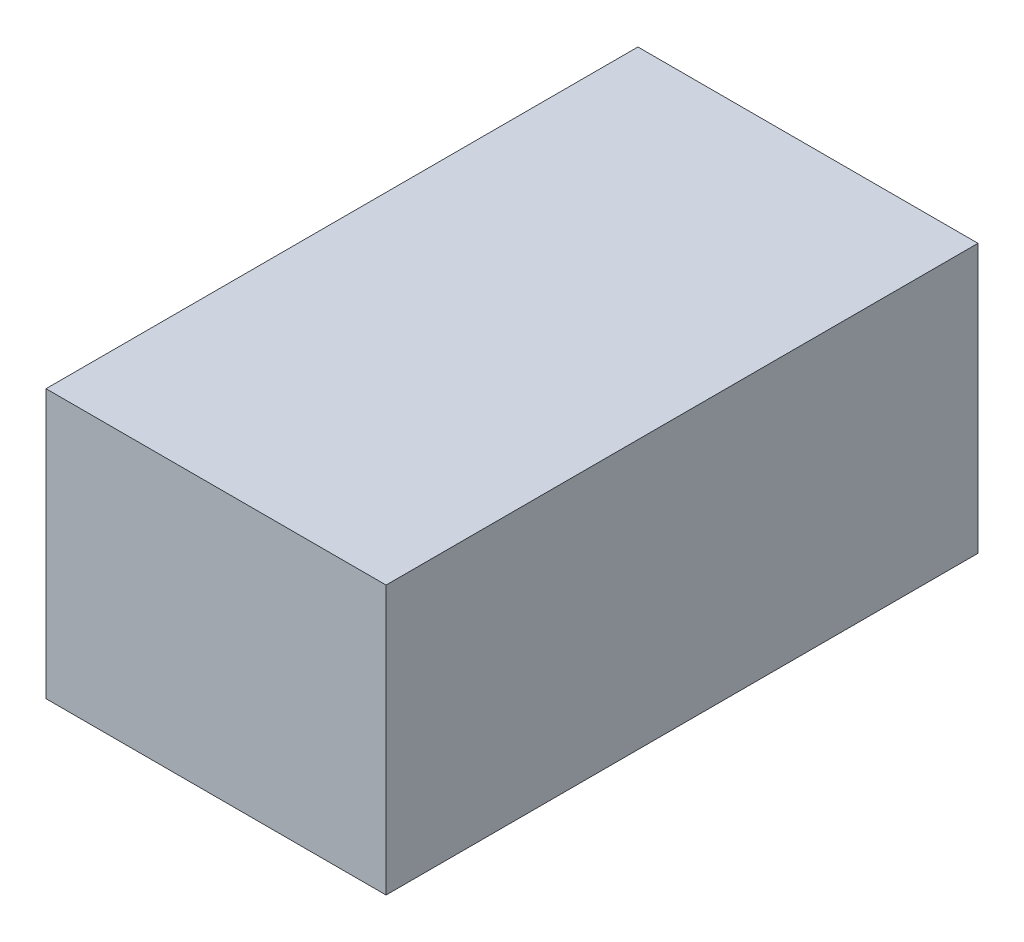
ISO-10303-21;
HEADER;
FILE_DESCRIPTION(('STEP AP214'),'2;1');
FILE_NAME('part.step','',(''),(''),'','','');
FILE_SCHEMA(('AUTOMOTIVE_DESIGN { 1 0 10303 214 1 1 1 1 }'));
ENDSEC;
DATA;
#1=APPLICATION_CONTEXT('core data for automotive mechanical design processes');
#2=APPLICATION_PROTOCOL_DEFINITION('international standard','automotive_design',2000,#1);
#3=PRODUCT_CONTEXT('',#1,'mechanical');
#4=PRODUCT('Part','Part','',(#3));
#5=PRODUCT_RELATED_PRODUCT_CATEGORY('part','',(#4));
#6=PRODUCT_DEFINITION_FORMATION('','',#4);
#7=PRODUCT_DEFINITION_CONTEXT('part definition',#1,'design');
#8=PRODUCT_DEFINITION('design','',#6,#7);
#9=PRODUCT_DEFINITION_SHAPE('','',#8);
#10=(LENGTH_UNIT() NAMED_UNIT(*) SI_UNIT(.MILLI.,.METRE.));
#11=(NAMED_UNIT(*) PLANE_ANGLE_UNIT() SI_UNIT($,.RADIAN.));
#12=(NAMED_UNIT(*) SI_UNIT($,.STERADIAN.) SOLID_ANGLE_UNIT());
#13=UNCERTAINTY_MEASURE_WITH_UNIT(LENGTH_MEASURE(1.E-05),#10,'distance_accuracy_value','');
#14=(GEOMETRIC_REPRESENTATION_CONTEXT(3) GLOBAL_UNCERTAINTY_ASSIGNED_CONTEXT((#13)) GLOBAL_UNIT_ASSIGNED_CONTEXT((#10,
#11,#12)) REPRESENTATION_CONTEXT('',''));
#15=CARTESIAN_POINT('',(0.,0.,0.));
#16=DIRECTION('',(0.,0.,1.));
#17=DIRECTION('',(1.,0.,0.));
#18=AXIS2_PLACEMENT_3D('',#15,#16,#17);
#19=CARTESIAN_POINT('',(0.2413,-0.1905,0.84000086));
#20=DIRECTION('',(0.,0.,1.));
#21=DIRECTION('',(1.,0.,0.));
#22=AXIS2_PLACEMENT_3D('',#19,#20,#21);
#23=PLANE('',#22);
#24=DIRECTION('',(0.,-1.,0.));
#25=VECTOR('',#24,1.);
#26=CARTESIAN_POINT('',(0.2413,0.1905,0.84000086));
#27=LINE('',#26,#25);
#28=CARTESIAN_POINT('',(0.2413,0.1905,0.84000086));
#29=VERTEX_POINT('',#28);
#30=CARTESIAN_POINT('',(0.2413,-0.1905,0.84000086));
#31=VERTEX_POINT('',#30);
#32=EDGE_CURVE('E20',#29,#31,#27,.T.);
#33=ORIENTED_EDGE('',*,*,#32,.F.);
#34=DIRECTION('',(1.,0.,0.));
#35=VECTOR('',#34,1.);
#36=CARTESIAN_POINT('',(-0.2413,0.1905,0.84000086));
#37=LINE('',#36,#35);
#38=CARTESIAN_POINT('',(-0.2413,0.1905,0.84000086));
#39=VERTEX_POINT('',#38);
#40=EDGE_CURVE('E99',#39,#29,#37,.T.);
#41=ORIENTED_EDGE('',*,*,#40,.F.);
#42=DIRECTION('',(0.,1.,0.));
#43=VECTOR('',#42,1.);
#44=CARTESIAN_POINT('',(-0.2413,-0.1905,0.84000086));
#45=LINE('',#44,#43);
#46=CARTESIAN_POINT('',(-0.2413,-0.1905,0.84000086));
#47=VERTEX_POINT('',#46);
#48=EDGE_CURVE('E84',#47,#39,#45,.T.);
#49=ORIENTED_EDGE('',*,*,#48,.F.);
#50=DIRECTION('',(-1.,0.,0.));
#51=VECTOR('',#50,1.);
#52=CARTESIAN_POINT('',(0.2413,-0.1905,0.84000086));
#53=LINE('',#52,#51);
#54=EDGE_CURVE('E88',#31,#47,#53,.T.);
#55=ORIENTED_EDGE('',*,*,#54,.F.);
#56=EDGE_LOOP('',(#33,#41,#49,#55));
#57=FACE_BOUND('',#56,.T.);
#58=ADVANCED_FACE('F17',(#57),#23,.T.);
#59=CARTESIAN_POINT('',(0.2413,-0.1905,0.));
#60=DIRECTION('',(0.,0.,1.));
#61=DIRECTION('',(1.,0.,0.));
#62=AXIS2_PLACEMENT_3D('',#59,#60,#61);
#63=PLANE('',#62);
#64=DIRECTION('',(-1.,0.,0.));
#65=VECTOR('',#64,1.);
#66=CARTESIAN_POINT('',(0.2413,-0.1905,0.));
#67=LINE('',#66,#65);
#68=CARTESIAN_POINT('',(0.2413,-0.1905,0.));
#69=VERTEX_POINT('',#68);
#70=CARTESIAN_POINT('',(-0.2413,-0.1905,0.));
#71=VERTEX_POINT('',#70);
#72=EDGE_CURVE('E72',#69,#71,#67,.T.);
#73=ORIENTED_EDGE('',*,*,#72,.T.);
#74=DIRECTION('',(0.,1.,0.));
#75=VECTOR('',#74,1.);
#76=CARTESIAN_POINT('',(-0.2413,-0.1905,0.));
#77=LINE('',#76,#75);
#78=CARTESIAN_POINT('',(-0.2413,0.1905,0.));
#79=VERTEX_POINT('',#78);
#80=EDGE_CURVE('E102',#71,#79,#77,.T.);
#81=ORIENTED_EDGE('',*,*,#80,.T.);
#82=DIRECTION('',(1.,0.,0.));
#83=VECTOR('',#82,1.);
#84=CARTESIAN_POINT('',(-0.2413,0.1905,0.));
#85=LINE('',#84,#83);
#86=CARTESIAN_POINT('',(0.2413,0.1905,0.));
#87=VERTEX_POINT('',#86);
#88=EDGE_CURVE('E74',#79,#87,#85,.T.);
#89=ORIENTED_EDGE('',*,*,#88,.T.);
#90=DIRECTION('',(0.,-1.,0.));
#91=VECTOR('',#90,1.);
#92=CARTESIAN_POINT('',(0.2413,0.1905,0.));
#93=LINE('',#92,#91);
#94=EDGE_CURVE('E11',#87,#69,#93,.T.);
#95=ORIENTED_EDGE('',*,*,#94,.T.);
#96=EDGE_LOOP('',(#73,#81,#89,#95));
#97=FACE_BOUND('',#96,.T.);
#98=ADVANCED_FACE('F70',(#97),#63,.F.);
#99=CARTESIAN_POINT('',(0.2413,0.1905,0.));
#100=DIRECTION('',(1.,0.,0.));
#101=DIRECTION('',(0.,1.,0.));
#102=AXIS2_PLACEMENT_3D('',#99,#100,#101);
#103=PLANE('',#102);
#104=DIRECTION('',(0.,0.,1.));
#105=VECTOR('',#104,1.);
#106=CARTESIAN_POINT('',(0.2413,0.1905,0.));
#107=LINE('',#106,#105);
#108=EDGE_CURVE('E96',#87,#29,#107,.T.);
#109=ORIENTED_EDGE('',*,*,#108,.T.);
#110=ORIENTED_EDGE('',*,*,#32,.T.);
#111=DIRECTION('',(0.,0.,1.));
#112=VECTOR('',#111,1.);
#113=CARTESIAN_POINT('',(0.2413,-0.1905,0.));
#114=LINE('',#113,#112);
#115=EDGE_CURVE('E80',#69,#31,#114,.T.);
#116=ORIENTED_EDGE('',*,*,#115,.F.);
#117=ORIENTED_EDGE('',*,*,#94,.F.);
#118=EDGE_LOOP('',(#109,#110,#116,#117));
#119=FACE_BOUND('',#118,.T.);
#120=ADVANCED_FACE('F86',(#119),#103,.T.);
#121=CARTESIAN_POINT('',(-0.2413,0.1905,0.));
#122=DIRECTION('',(0.,1.,0.));
#123=DIRECTION('',(1.,0.,0.));
#124=AXIS2_PLACEMENT_3D('',#121,#122,#123);
#125=PLANE('',#124);
#126=DIRECTION('',(0.,0.,1.));
#127=VECTOR('',#126,1.);
#128=CARTESIAN_POINT('',(-0.2413,0.1905,0.));
#129=LINE('',#128,#127);
#130=EDGE_CURVE('E106',#79,#39,#129,.T.);
#131=ORIENTED_EDGE('',*,*,#130,.T.);
#132=ORIENTED_EDGE('',*,*,#40,.T.);
#133=ORIENTED_EDGE('',*,*,#108,.F.);
#134=ORIENTED_EDGE('',*,*,#88,.F.);
#135=EDGE_LOOP('',(#131,#132,#133,#134));
#136=FACE_BOUND('',#135,.T.);
#137=ADVANCED_FACE('F130',(#136),#125,.T.);
#138=CARTESIAN_POINT('',(-0.2413,-0.1905,0.));
#139=DIRECTION('',(-1.,0.,0.));
#140=DIRECTION('',(0.,0.,1.));
#141=AXIS2_PLACEMENT_3D('',#138,#139,#140);
#142=PLANE('',#141);
#143=DIRECTION('',(0.,0.,1.));
#144=VECTOR('',#143,1.);
#145=CARTESIAN_POINT('',(-0.2413,-0.1905,0.));
#146=LINE('',#145,#144);
#147=EDGE_CURVE('E82',#71,#47,#146,.T.);
#148=ORIENTED_EDGE('',*,*,#147,.T.);
#149=ORIENTED_EDGE('',*,*,#48,.T.);
#150=ORIENTED_EDGE('',*,*,#130,.F.);
#151=ORIENTED_EDGE('',*,*,#80,.F.);
#152=EDGE_LOOP('',(#148,#149,#150,#151));
#153=FACE_BOUND('',#152,.T.);
#154=ADVANCED_FACE('F122',(#153),#142,.T.);
#155=CARTESIAN_POINT('',(0.2413,-0.1905,0.));
#156=DIRECTION('',(0.,-1.,0.));
#157=DIRECTION('',(0.,0.,-1.));
#158=AXIS2_PLACEMENT_3D('',#155,#156,#157);
#159=PLANE('',#158);
#160=ORIENTED_EDGE('',*,*,#115,.T.);
#161=ORIENTED_EDGE('',*,*,#54,.T.);
#162=ORIENTED_EDGE('',*,*,#147,.F.);
#163=ORIENTED_EDGE('',*,*,#72,.F.);
#164=EDGE_LOOP('',(#160,#161,#162,#163));
#165=FACE_BOUND('',#164,.T.);
#166=ADVANCED_FACE('F78',(#165),#159,.T.);
#167=CLOSED_SHELL('',(#58,#98,#120,#137,#154,#166));
#168=MANIFOLD_SOLID_BREP('B1',#167);
#169=ADVANCED_BREP_SHAPE_REPRESENTATION('',(#18,#168),#14);
#170=SHAPE_DEFINITION_REPRESENTATION(#9,#169);
ENDSEC;
END-ISO-10303-21;
